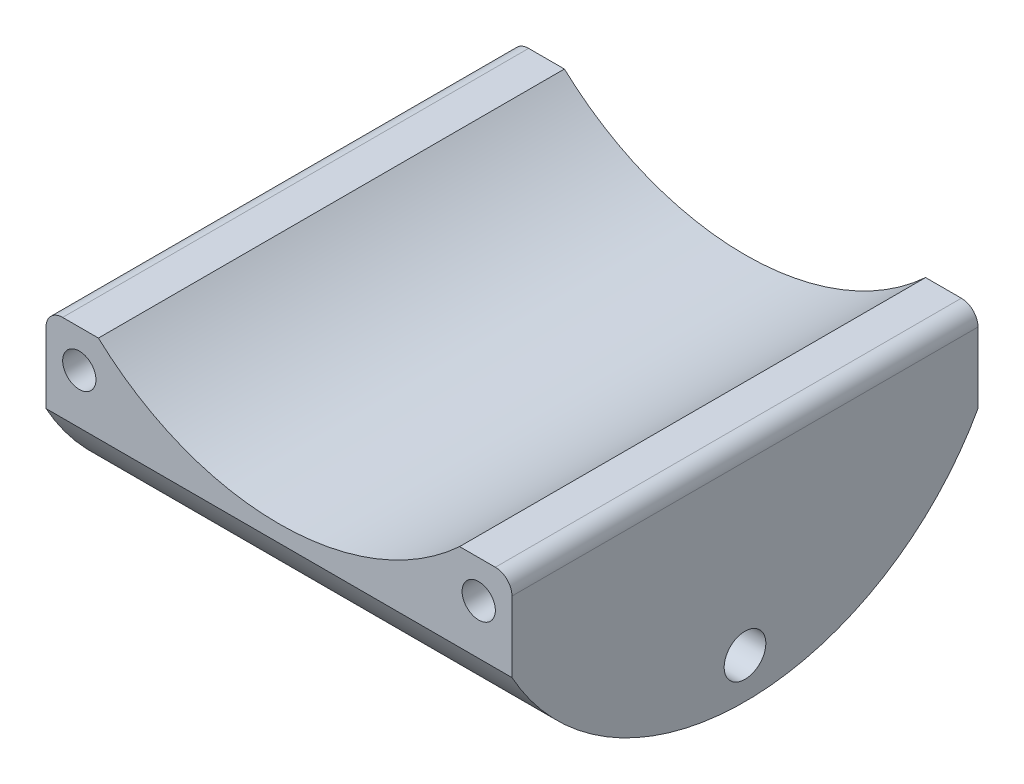
ISO-10303-21;
HEADER;
FILE_DESCRIPTION(('STEP AP214'),'2;1');
FILE_NAME('part.step','',(''),(''),'','','');
FILE_SCHEMA(('AUTOMOTIVE_DESIGN { 1 0 10303 214 1 1 1 1 }'));
ENDSEC;
DATA;
#1=APPLICATION_CONTEXT('core data for automotive mechanical design processes');
#2=APPLICATION_PROTOCOL_DEFINITION('international standard','automotive_design',2000,#1);
#3=PRODUCT_CONTEXT('',#1,'mechanical');
#4=PRODUCT('Part','Part','',(#3));
#5=PRODUCT_RELATED_PRODUCT_CATEGORY('part','',(#4));
#6=PRODUCT_DEFINITION_FORMATION('','',#4);
#7=PRODUCT_DEFINITION_CONTEXT('part definition',#1,'design');
#8=PRODUCT_DEFINITION('design','',#6,#7);
#9=PRODUCT_DEFINITION_SHAPE('','',#8);
#10=(LENGTH_UNIT() NAMED_UNIT(*) SI_UNIT(.MILLI.,.METRE.));
#11=(NAMED_UNIT(*) PLANE_ANGLE_UNIT() SI_UNIT($,.RADIAN.));
#12=(NAMED_UNIT(*) SI_UNIT($,.STERADIAN.) SOLID_ANGLE_UNIT());
#13=UNCERTAINTY_MEASURE_WITH_UNIT(LENGTH_MEASURE(1.E-05),#10,'distance_accuracy_value','');
#14=(GEOMETRIC_REPRESENTATION_CONTEXT(3) GLOBAL_UNCERTAINTY_ASSIGNED_CONTEXT((#13)) GLOBAL_UNIT_ASSIGNED_CONTEXT((#10,
#11,#12)) REPRESENTATION_CONTEXT('',''));
#15=CARTESIAN_POINT('',(0.,0.,0.));
#16=DIRECTION('',(0.,0.,1.));
#17=DIRECTION('',(1.,0.,0.));
#18=AXIS2_PLACEMENT_3D('',#15,#16,#17);
#19=CARTESIAN_POINT('',(-44.45,7.9502,0.));
#20=DIRECTION('',(1.,0.,0.));
#21=DIRECTION('',(0.,0.,-1.));
#22=AXIS2_PLACEMENT_3D('',#19,#20,#21);
#23=PLANE('',#22);
#24=DIRECTION('',(0.,-1.,0.));
#25=VECTOR('',#24,1.);
#26=CARTESIAN_POINT('',(-44.45,0.,44.45));
#27=LINE('',#26,#25);
#28=CARTESIAN_POINT('',(-44.45,-3.175,44.45));
#29=VERTEX_POINT('',#28);
#30=CARTESIAN_POINT('',(-44.45,-16.6432442484171,44.45));
#31=VERTEX_POINT('',#30);
#32=EDGE_CURVE('E150',#29,#31,#27,.T.);
#33=ORIENTED_EDGE('',*,*,#32,.F.);
#34=DIRECTION('',(0.,0.,-1.));
#35=VECTOR('',#34,1.);
#36=CARTESIAN_POINT('',(-44.45,-3.175,-44.45));
#37=LINE('',#36,#35);
#38=CARTESIAN_POINT('',(-44.45,-3.175,-44.45));
#39=VERTEX_POINT('',#38);
#40=EDGE_CURVE('E40',#29,#39,#37,.T.);
#41=ORIENTED_EDGE('',*,*,#40,.T.);
#42=DIRECTION('',(0.,-1.,0.));
#43=VECTOR('',#42,1.);
#44=CARTESIAN_POINT('',(-44.45,0.,-44.45));
#45=LINE('',#44,#43);
#46=CARTESIAN_POINT('',(-44.45,-16.6432442484171,-44.45));
#47=VERTEX_POINT('',#46);
#48=EDGE_CURVE('E123',#39,#47,#45,.T.);
#49=ORIENTED_EDGE('',*,*,#48,.T.);
#50=CARTESIAN_POINT('',(-44.45,7.9502,0.));
#51=DIRECTION('',(1.,0.,0.));
#52=DIRECTION('',(0.,0.,-1.));
#53=AXIS2_PLACEMENT_3D('',#50,#51,#52);
#54=CIRCLE('',#53,50.8);
#55=EDGE_CURVE('E159',#31,#47,#54,.T.);
#56=ORIENTED_EDGE('',*,*,#55,.F.);
#57=EDGE_LOOP('',(#33,#41,#49,#56));
#58=FACE_BOUND('',#57,.T.);
#59=CARTESIAN_POINT('',(-44.45,-35.179,0.));
#60=DIRECTION('',(1.,0.,0.));
#61=DIRECTION('',(0.,0.,-1.));
#62=AXIS2_PLACEMENT_3D('',#59,#60,#61);
#63=CIRCLE('',#62,3.9751);
#64=CARTESIAN_POINT('',(-44.45,-35.179,-3.9751));
#65=VERTEX_POINT('',#64);
#66=EDGE_CURVE('E198',#65,#65,#63,.T.);
#67=ORIENTED_EDGE('',*,*,#66,.T.);
#68=EDGE_LOOP('',(#67));
#69=FACE_BOUND('',#68,.T.);
#70=ADVANCED_FACE('F32',(#58,#69),#23,.F.);
#71=CARTESIAN_POINT('',(44.45,0.,-44.45));
#72=DIRECTION('',(0.,0.,-1.));
#73=DIRECTION('',(0.,1.,0.));
#74=AXIS2_PLACEMENT_3D('',#71,#72,#73);
#75=PLANE('',#74);
#76=CARTESIAN_POINT('',(-38.1,-7.13740000000001,-44.45));
#77=DIRECTION('',(0.,0.,1.));
#78=DIRECTION('',(1.,0.,0.));
#79=AXIS2_PLACEMENT_3D('',#76,#77,#78);
#80=CIRCLE('',#79,3.17500000000001);
#81=CARTESIAN_POINT('',(-34.925,-7.13740000000001,-44.45));
#82=VERTEX_POINT('',#81);
#83=EDGE_CURVE('E180',#82,#82,#80,.T.);
#84=ORIENTED_EDGE('',*,*,#83,.T.);
#85=EDGE_LOOP('',(#84));
#86=FACE_BOUND('',#85,.T.);
#87=DIRECTION('',(-1.,0.,0.));
#88=VECTOR('',#87,1.);
#89=CARTESIAN_POINT('',(44.45,0.,-44.45));
#90=LINE('',#89,#88);
#91=CARTESIAN_POINT('',(41.275,0.,-44.45));
#92=VERTEX_POINT('',#91);
#93=CARTESIAN_POINT('',(34.4525762825388,0.,-44.45));
#94=VERTEX_POINT('',#93);
#95=EDGE_CURVE('E125',#92,#94,#90,.T.);
#96=ORIENTED_EDGE('',*,*,#95,.F.);
#97=CARTESIAN_POINT('',(41.275,-3.175,-44.45));
#98=DIRECTION('',(0.,0.,-1.));
#99=DIRECTION('',(0.,1.,0.));
#100=AXIS2_PLACEMENT_3D('',#97,#98,#99);
#101=CIRCLE('',#100,3.175);
#102=CARTESIAN_POINT('',(44.45,-3.175,-44.45));
#103=VERTEX_POINT('',#102);
#104=EDGE_CURVE('E138',#92,#103,#101,.T.);
#105=ORIENTED_EDGE('',*,*,#104,.T.);
#106=DIRECTION('',(0.,-1.,0.));
#107=VECTOR('',#106,1.);
#108=CARTESIAN_POINT('',(44.45,0.,-44.45));
#109=LINE('',#108,#107);
#110=CARTESIAN_POINT('',(44.45,-16.6432442484171,-44.45));
#111=VERTEX_POINT('',#110);
#112=EDGE_CURVE('E116',#103,#111,#109,.T.);
#113=ORIENTED_EDGE('',*,*,#112,.T.);
#114=DIRECTION('',(-1.,0.,0.));
#115=VECTOR('',#114,1.);
#116=CARTESIAN_POINT('',(44.45,-16.6432442484171,-44.45));
#117=LINE('',#116,#115);
#118=EDGE_CURVE('E127',#111,#47,#117,.T.);
#119=ORIENTED_EDGE('',*,*,#118,.T.);
#120=ORIENTED_EDGE('',*,*,#48,.F.);
#121=CARTESIAN_POINT('',(-41.275,-3.175,-44.45));
#122=DIRECTION('',(0.,0.,-1.));
#123=DIRECTION('',(0.,1.,0.));
#124=AXIS2_PLACEMENT_3D('',#121,#122,#123);
#125=CIRCLE('',#124,3.175);
#126=CARTESIAN_POINT('',(-41.275,0.,-44.45));
#127=VERTEX_POINT('',#126);
#128=EDGE_CURVE('E136',#39,#127,#125,.T.);
#129=ORIENTED_EDGE('',*,*,#128,.T.);
#130=CARTESIAN_POINT('',(-34.4525762825388,0.,-44.45));
#131=VERTEX_POINT('',#130);
#132=EDGE_CURVE('E118',#131,#127,#90,.T.);
#133=ORIENTED_EDGE('',*,*,#132,.F.);
#134=CARTESIAN_POINT('',(0.,37.3317557515829,-44.45));
#135=DIRECTION('',(0.,0.,-1.));
#136=DIRECTION('',(0.,1.,0.));
#137=AXIS2_PLACEMENT_3D('',#134,#135,#136);
#138=CIRCLE('',#137,50.8);
#139=EDGE_CURVE('E104',#131,#94,#138,.F.);
#140=ORIENTED_EDGE('',*,*,#139,.T.);
#141=EDGE_LOOP('',(#96,#105,#113,#119,#120,#129,#133,#140));
#142=FACE_BOUND('',#141,.T.);
#143=CARTESIAN_POINT('',(38.1,-7.13740000000001,-44.45));
#144=DIRECTION('',(0.,0.,1.));
#145=DIRECTION('',(1.,0.,0.));
#146=AXIS2_PLACEMENT_3D('',#143,#144,#145);
#147=CIRCLE('',#146,3.17500000000001);
#148=CARTESIAN_POINT('',(41.275,-7.13740000000001,-44.45));
#149=VERTEX_POINT('',#148);
#150=EDGE_CURVE('E186',#149,#149,#147,.T.);
#151=ORIENTED_EDGE('',*,*,#150,.T.);
#152=EDGE_LOOP('',(#151));
#153=FACE_BOUND('',#152,.T.);
#154=ADVANCED_FACE('F154',(#86,#142,#153),#75,.T.);
#155=CARTESIAN_POINT('',(44.45,0.,44.45));
#156=DIRECTION('',(0.,0.,-1.));
#157=DIRECTION('',(0.,1.,0.));
#158=AXIS2_PLACEMENT_3D('',#155,#156,#157);
#159=PLANE('',#158);
#160=CARTESIAN_POINT('',(38.1,-7.13740000000001,44.45));
#161=DIRECTION('',(0.,0.,1.));
#162=DIRECTION('',(1.,0.,0.));
#163=AXIS2_PLACEMENT_3D('',#160,#161,#162);
#164=CIRCLE('',#163,3.17500000000001);
#165=CARTESIAN_POINT('',(41.275,-7.13740000000001,44.45));
#166=VERTEX_POINT('',#165);
#167=EDGE_CURVE('E176',#166,#166,#164,.T.);
#168=ORIENTED_EDGE('',*,*,#167,.F.);
#169=EDGE_LOOP('',(#168));
#170=FACE_BOUND('',#169,.T.);
#171=CARTESIAN_POINT('',(-38.1,-7.13740000000001,44.45));
#172=DIRECTION('',(0.,0.,1.));
#173=DIRECTION('',(1.,0.,0.));
#174=AXIS2_PLACEMENT_3D('',#171,#172,#173);
#175=CIRCLE('',#174,3.17500000000001);
#176=CARTESIAN_POINT('',(-34.925,-7.13740000000001,44.45));
#177=VERTEX_POINT('',#176);
#178=EDGE_CURVE('E168',#177,#177,#175,.T.);
#179=ORIENTED_EDGE('',*,*,#178,.F.);
#180=EDGE_LOOP('',(#179));
#181=FACE_BOUND('',#180,.T.);
#182=DIRECTION('',(0.,-1.,0.));
#183=VECTOR('',#182,1.);
#184=CARTESIAN_POINT('',(44.45,0.,44.45));
#185=LINE('',#184,#183);
#186=CARTESIAN_POINT('',(44.45,-3.175,44.45));
#187=VERTEX_POINT('',#186);
#188=CARTESIAN_POINT('',(44.45,-16.6432442484171,44.45));
#189=VERTEX_POINT('',#188);
#190=EDGE_CURVE('E158',#187,#189,#185,.T.);
#191=ORIENTED_EDGE('',*,*,#190,.F.);
#192=CARTESIAN_POINT('',(41.275,-3.175,44.45));
#193=DIRECTION('',(0.,0.,-1.));
#194=DIRECTION('',(0.,1.,0.));
#195=AXIS2_PLACEMENT_3D('',#192,#193,#194);
#196=CIRCLE('',#195,3.175);
#197=CARTESIAN_POINT('',(41.275,0.,44.45));
#198=VERTEX_POINT('',#197);
#199=EDGE_CURVE('E143',#187,#198,#196,.F.);
#200=ORIENTED_EDGE('',*,*,#199,.T.);
#201=DIRECTION('',(-1.,0.,0.));
#202=VECTOR('',#201,1.);
#203=CARTESIAN_POINT('',(44.45,0.,44.45));
#204=LINE('',#203,#202);
#205=CARTESIAN_POINT('',(34.4525762825388,0.,44.45));
#206=VERTEX_POINT('',#205);
#207=EDGE_CURVE('E112',#198,#206,#204,.T.);
#208=ORIENTED_EDGE('',*,*,#207,.T.);
#209=CARTESIAN_POINT('',(0.,37.3317557515829,44.45));
#210=DIRECTION('',(0.,0.,1.));
#211=DIRECTION('',(1.,0.,0.));
#212=AXIS2_PLACEMENT_3D('',#209,#210,#211);
#213=CIRCLE('',#212,50.8);
#214=CARTESIAN_POINT('',(-34.4525762825388,0.,44.45));
#215=VERTEX_POINT('',#214);
#216=EDGE_CURVE('E101',#215,#206,#213,.T.);
#217=ORIENTED_EDGE('',*,*,#216,.F.);
#218=CARTESIAN_POINT('',(-41.275,0.,44.45));
#219=VERTEX_POINT('',#218);
#220=EDGE_CURVE('E110',#215,#219,#204,.T.);
#221=ORIENTED_EDGE('',*,*,#220,.T.);
#222=CARTESIAN_POINT('',(-41.275,-3.175,44.45));
#223=DIRECTION('',(0.,0.,-1.));
#224=DIRECTION('',(0.,1.,0.));
#225=AXIS2_PLACEMENT_3D('',#222,#223,#224);
#226=CIRCLE('',#225,3.175);
#227=EDGE_CURVE('E47',#219,#29,#226,.F.);
#228=ORIENTED_EDGE('',*,*,#227,.T.);
#229=ORIENTED_EDGE('',*,*,#32,.T.);
#230=DIRECTION('',(-1.,0.,0.));
#231=VECTOR('',#230,1.);
#232=CARTESIAN_POINT('',(44.45,-16.6432442484171,44.45));
#233=LINE('',#232,#231);
#234=EDGE_CURVE('E130',#189,#31,#233,.T.);
#235=ORIENTED_EDGE('',*,*,#234,.F.);
#236=EDGE_LOOP('',(#191,#200,#208,#217,#221,#228,#229,#235));
#237=FACE_BOUND('',#236,.T.);
#238=ADVANCED_FACE('F109',(#170,#181,#237),#159,.F.);
#239=CARTESIAN_POINT('',(44.45,0.,44.45));
#240=DIRECTION('',(0.,1.,0.));
#241=DIRECTION('',(0.,0.,1.));
#242=AXIS2_PLACEMENT_3D('',#239,#240,#241);
#243=PLANE('',#242);
#244=ORIENTED_EDGE('',*,*,#207,.F.);
#245=DIRECTION('',(0.,0.,-1.));
#246=VECTOR('',#245,1.);
#247=CARTESIAN_POINT('',(41.275,0.,44.45));
#248=LINE('',#247,#246);
#249=EDGE_CURVE('E133',#198,#92,#248,.T.);
#250=ORIENTED_EDGE('',*,*,#249,.T.);
#251=ORIENTED_EDGE('',*,*,#95,.T.);
#252=DIRECTION('',(0.,0.,-1.));
#253=VECTOR('',#252,1.);
#254=CARTESIAN_POINT('',(34.4525762825388,0.,44.45));
#255=LINE('',#254,#253);
#256=EDGE_CURVE('E113',#206,#94,#255,.T.);
#257=ORIENTED_EDGE('',*,*,#256,.F.);
#258=EDGE_LOOP('',(#244,#250,#251,#257));
#259=FACE_BOUND('',#258,.T.);
#260=ADVANCED_FACE('F226',(#259),#243,.T.);
#261=ORIENTED_EDGE('',*,*,#132,.T.);
#262=DIRECTION('',(0.,0.,-1.));
#263=VECTOR('',#262,1.);
#264=CARTESIAN_POINT('',(-41.275,0.,44.45));
#265=LINE('',#264,#263);
#266=EDGE_CURVE('E11',#127,#219,#265,.F.);
#267=ORIENTED_EDGE('',*,*,#266,.T.);
#268=ORIENTED_EDGE('',*,*,#220,.F.);
#269=DIRECTION('',(0.,0.,-1.));
#270=VECTOR('',#269,1.);
#271=CARTESIAN_POINT('',(-34.4525762825388,0.,44.45));
#272=LINE('',#271,#270);
#273=EDGE_CURVE('E97',#215,#131,#272,.T.);
#274=ORIENTED_EDGE('',*,*,#273,.T.);
#275=EDGE_LOOP('',(#261,#267,#268,#274));
#276=FACE_BOUND('',#275,.T.);
#277=ADVANCED_FACE('F115',(#276),#243,.T.);
#278=CARTESIAN_POINT('',(44.45,7.9502,0.));
#279=DIRECTION('',(-1.,0.,0.));
#280=DIRECTION('',(0.,0.,1.));
#281=AXIS2_PLACEMENT_3D('',#278,#279,#280);
#282=CYLINDRICAL_SURFACE('',#281,50.8);
#283=ORIENTED_EDGE('',*,*,#55,.T.);
#284=ORIENTED_EDGE('',*,*,#118,.F.);
#285=CARTESIAN_POINT('',(44.45,7.9502,0.));
#286=DIRECTION('',(1.,0.,0.));
#287=DIRECTION('',(0.,0.,-1.));
#288=AXIS2_PLACEMENT_3D('',#285,#286,#287);
#289=CIRCLE('',#288,50.8);
#290=EDGE_CURVE('E119',#189,#111,#289,.T.);
#291=ORIENTED_EDGE('',*,*,#290,.F.);
#292=ORIENTED_EDGE('',*,*,#234,.T.);
#293=EDGE_LOOP('',(#283,#284,#291,#292));
#294=FACE_BOUND('',#293,.T.);
#295=ADVANCED_FACE('F230',(#294),#282,.T.);
#296=CARTESIAN_POINT('',(44.45,7.9502,0.));
#297=DIRECTION('',(1.,0.,0.));
#298=DIRECTION('',(0.,0.,-1.));
#299=AXIS2_PLACEMENT_3D('',#296,#297,#298);
#300=PLANE('',#299);
#301=CARTESIAN_POINT('',(44.45,-35.179,0.));
#302=DIRECTION('',(1.,0.,0.));
#303=DIRECTION('',(0.,0.,-1.));
#304=AXIS2_PLACEMENT_3D('',#301,#302,#303);
#305=CIRCLE('',#304,3.9751);
#306=CARTESIAN_POINT('',(44.45,-35.179,-3.9751));
#307=VERTEX_POINT('',#306);
#308=EDGE_CURVE('E192',#307,#307,#305,.T.);
#309=ORIENTED_EDGE('',*,*,#308,.F.);
#310=EDGE_LOOP('',(#309));
#311=FACE_BOUND('',#310,.T.);
#312=ORIENTED_EDGE('',*,*,#112,.F.);
#313=DIRECTION('',(0.,0.,-1.));
#314=VECTOR('',#313,1.);
#315=CARTESIAN_POINT('',(44.45,-3.175,0.));
#316=LINE('',#315,#314);
#317=EDGE_CURVE('E140',#103,#187,#316,.F.);
#318=ORIENTED_EDGE('',*,*,#317,.T.);
#319=ORIENTED_EDGE('',*,*,#190,.T.);
#320=ORIENTED_EDGE('',*,*,#290,.T.);
#321=EDGE_LOOP('',(#312,#318,#319,#320));
#322=FACE_BOUND('',#321,.T.);
#323=ADVANCED_FACE('F224',(#311,#322),#300,.T.);
#324=CARTESIAN_POINT('',(0.,37.3317557515829,44.45));
#325=DIRECTION('',(0.,0.,-1.));
#326=DIRECTION('',(-1.,0.,0.));
#327=AXIS2_PLACEMENT_3D('',#324,#325,#326);
#328=CYLINDRICAL_SURFACE('',#327,50.8);
#329=ORIENTED_EDGE('',*,*,#139,.F.);
#330=ORIENTED_EDGE('',*,*,#273,.F.);
#331=ORIENTED_EDGE('',*,*,#216,.T.);
#332=ORIENTED_EDGE('',*,*,#256,.T.);
#333=EDGE_LOOP('',(#329,#330,#331,#332));
#334=FACE_BOUND('',#333,.T.);
#335=ADVANCED_FACE('F99',(#334),#328,.F.);
#336=CARTESIAN_POINT('',(41.275,-3.175,44.45));
#337=DIRECTION('',(0.,0.,-1.));
#338=DIRECTION('',(-1.,0.,0.));
#339=AXIS2_PLACEMENT_3D('',#336,#337,#338);
#340=CYLINDRICAL_SURFACE('',#339,3.175);
#341=ORIENTED_EDGE('',*,*,#199,.F.);
#342=ORIENTED_EDGE('',*,*,#317,.F.);
#343=ORIENTED_EDGE('',*,*,#104,.F.);
#344=ORIENTED_EDGE('',*,*,#249,.F.);
#345=EDGE_LOOP('',(#341,#342,#343,#344));
#346=FACE_BOUND('',#345,.T.);
#347=ADVANCED_FACE('F235',(#346),#340,.T.);
#348=CARTESIAN_POINT('',(-41.275,-3.175,0.));
#349=DIRECTION('',(0.,0.,1.));
#350=DIRECTION('',(1.,0.,0.));
#351=AXIS2_PLACEMENT_3D('',#348,#349,#350);
#352=CYLINDRICAL_SURFACE('',#351,3.175);
#353=ORIENTED_EDGE('',*,*,#227,.F.);
#354=ORIENTED_EDGE('',*,*,#266,.F.);
#355=ORIENTED_EDGE('',*,*,#128,.F.);
#356=ORIENTED_EDGE('',*,*,#40,.F.);
#357=EDGE_LOOP('',(#353,#354,#355,#356));
#358=FACE_BOUND('',#357,.T.);
#359=ADVANCED_FACE('F34',(#358),#352,.T.);
#360=CARTESIAN_POINT('',(-38.1,-7.13740000000001,23.8125));
#361=DIRECTION('',(0.,0.,1.));
#362=DIRECTION('',(1.,0.,0.));
#363=AXIS2_PLACEMENT_3D('',#360,#361,#362);
#364=CYLINDRICAL_SURFACE('',#363,3.17500000000001);
#365=CARTESIAN_POINT('',(-38.1,-7.13740000000001,23.8125));
#366=DIRECTION('',(0.,0.,1.));
#367=DIRECTION('',(1.,0.,0.));
#368=AXIS2_PLACEMENT_3D('',#365,#366,#367);
#369=CIRCLE('',#368,3.17500000000001);
#370=CARTESIAN_POINT('',(-34.925,-7.13740000000001,23.8125));
#371=VERTEX_POINT('',#370);
#372=EDGE_CURVE('E106',#371,#371,#369,.T.);
#373=ORIENTED_EDGE('',*,*,#372,.F.);
#374=EDGE_LOOP('',(#373));
#375=FACE_BOUND('',#374,.T.);
#376=ORIENTED_EDGE('',*,*,#178,.T.);
#377=EDGE_LOOP('',(#376));
#378=FACE_BOUND('',#377,.T.);
#379=ADVANCED_FACE('F242',(#375,#378),#364,.F.);
#380=CARTESIAN_POINT('',(-38.1,-7.13740000000001,23.8125));
#381=DIRECTION('',(0.,0.,1.));
#382=DIRECTION('',(1.,0.,0.));
#383=AXIS2_PLACEMENT_3D('',#380,#381,#382);
#384=PLANE('',#383);
#385=ORIENTED_EDGE('',*,*,#372,.T.);
#386=EDGE_LOOP('',(#385));
#387=FACE_BOUND('',#386,.T.);
#388=ADVANCED_FACE('F290',(#387),#384,.T.);
#389=CARTESIAN_POINT('',(38.1,-7.13740000000001,23.8125));
#390=DIRECTION('',(0.,0.,1.));
#391=DIRECTION('',(1.,0.,0.));
#392=AXIS2_PLACEMENT_3D('',#389,#390,#391);
#393=CYLINDRICAL_SURFACE('',#392,3.17500000000001);
#394=CARTESIAN_POINT('',(38.1,-7.13740000000001,23.8125));
#395=DIRECTION('',(0.,0.,1.));
#396=DIRECTION('',(1.,0.,0.));
#397=AXIS2_PLACEMENT_3D('',#394,#395,#396);
#398=CIRCLE('',#397,3.17500000000001);
#399=CARTESIAN_POINT('',(41.275,-7.13740000000001,23.8125));
#400=VERTEX_POINT('',#399);
#401=EDGE_CURVE('E171',#400,#400,#398,.T.);
#402=ORIENTED_EDGE('',*,*,#401,.F.);
#403=EDGE_LOOP('',(#402));
#404=FACE_BOUND('',#403,.T.);
#405=ORIENTED_EDGE('',*,*,#167,.T.);
#406=EDGE_LOOP('',(#405));
#407=FACE_BOUND('',#406,.T.);
#408=ADVANCED_FACE('F286',(#404,#407),#393,.F.);
#409=CARTESIAN_POINT('',(38.1,-7.13740000000001,23.8125));
#410=DIRECTION('',(0.,0.,1.));
#411=DIRECTION('',(1.,0.,0.));
#412=AXIS2_PLACEMENT_3D('',#409,#410,#411);
#413=PLANE('',#412);
#414=ORIENTED_EDGE('',*,*,#401,.T.);
#415=EDGE_LOOP('',(#414));
#416=FACE_BOUND('',#415,.T.);
#417=ADVANCED_FACE('F282',(#416),#413,.T.);
#418=CARTESIAN_POINT('',(-38.1,-7.13740000000001,-23.8125));
#419=DIRECTION('',(0.,0.,-1.));
#420=DIRECTION('',(-1.,0.,0.));
#421=AXIS2_PLACEMENT_3D('',#418,#419,#420);
#422=CYLINDRICAL_SURFACE('',#421,3.17500000000001);
#423=CARTESIAN_POINT('',(-38.1,-7.13740000000001,-23.8125));
#424=DIRECTION('',(0.,0.,1.));
#425=DIRECTION('',(1.,0.,0.));
#426=AXIS2_PLACEMENT_3D('',#423,#424,#425);
#427=CIRCLE('',#426,3.17500000000001);
#428=CARTESIAN_POINT('',(-34.925,-7.13740000000001,-23.8125));
#429=VERTEX_POINT('',#428);
#430=EDGE_CURVE('E179',#429,#429,#427,.T.);
#431=ORIENTED_EDGE('',*,*,#430,.T.);
#432=EDGE_LOOP('',(#431));
#433=FACE_BOUND('',#432,.T.);
#434=ORIENTED_EDGE('',*,*,#83,.F.);
#435=EDGE_LOOP('',(#434));
#436=FACE_BOUND('',#435,.T.);
#437=ADVANCED_FACE('F278',(#433,#436),#422,.F.);
#438=CARTESIAN_POINT('',(-38.1,-7.13740000000001,-23.8125));
#439=DIRECTION('',(0.,0.,-1.));
#440=DIRECTION('',(1.,0.,0.));
#441=AXIS2_PLACEMENT_3D('',#438,#439,#440);
#442=PLANE('',#441);
#443=ORIENTED_EDGE('',*,*,#430,.F.);
#444=EDGE_LOOP('',(#443));
#445=FACE_BOUND('',#444,.T.);
#446=ADVANCED_FACE('F274',(#445),#442,.T.);
#447=CARTESIAN_POINT('',(38.1,-7.13740000000001,-23.8125));
#448=DIRECTION('',(0.,0.,-1.));
#449=DIRECTION('',(-1.,0.,0.));
#450=AXIS2_PLACEMENT_3D('',#447,#448,#449);
#451=CYLINDRICAL_SURFACE('',#450,3.17500000000001);
#452=CARTESIAN_POINT('',(38.1,-7.13740000000001,-23.8125));
#453=DIRECTION('',(0.,0.,1.));
#454=DIRECTION('',(1.,0.,0.));
#455=AXIS2_PLACEMENT_3D('',#452,#453,#454);
#456=CIRCLE('',#455,3.17500000000001);
#457=CARTESIAN_POINT('',(41.275,-7.13740000000001,-23.8125));
#458=VERTEX_POINT('',#457);
#459=EDGE_CURVE('E183',#458,#458,#456,.T.);
#460=ORIENTED_EDGE('',*,*,#459,.T.);
#461=EDGE_LOOP('',(#460));
#462=FACE_BOUND('',#461,.T.);
#463=ORIENTED_EDGE('',*,*,#150,.F.);
#464=EDGE_LOOP('',(#463));
#465=FACE_BOUND('',#464,.T.);
#466=ADVANCED_FACE('F267',(#462,#465),#451,.F.);
#467=CARTESIAN_POINT('',(38.1,-7.13740000000001,-23.8125));
#468=DIRECTION('',(0.,0.,-1.));
#469=DIRECTION('',(1.,0.,0.));
#470=AXIS2_PLACEMENT_3D('',#467,#468,#469);
#471=PLANE('',#470);
#472=ORIENTED_EDGE('',*,*,#459,.F.);
#473=EDGE_LOOP('',(#472));
#474=FACE_BOUND('',#473,.T.);
#475=ADVANCED_FACE('F258',(#474),#471,.T.);
#476=CARTESIAN_POINT('',(26.9875,-35.179,0.));
#477=DIRECTION('',(1.,0.,0.));
#478=DIRECTION('',(0.,0.,-1.));
#479=AXIS2_PLACEMENT_3D('',#476,#477,#478);
#480=CYLINDRICAL_SURFACE('',#479,3.9751);
#481=CARTESIAN_POINT('',(26.9875,-35.179,0.));
#482=DIRECTION('',(1.,0.,0.));
#483=DIRECTION('',(0.,0.,-1.));
#484=AXIS2_PLACEMENT_3D('',#481,#482,#483);
#485=CIRCLE('',#484,3.9751);
#486=CARTESIAN_POINT('',(26.9875,-35.179,-3.9751));
#487=VERTEX_POINT('',#486);
#488=EDGE_CURVE('E189',#487,#487,#485,.T.);
#489=ORIENTED_EDGE('',*,*,#488,.F.);
#490=EDGE_LOOP('',(#489));
#491=FACE_BOUND('',#490,.T.);
#492=ORIENTED_EDGE('',*,*,#308,.T.);
#493=EDGE_LOOP('',(#492));
#494=FACE_BOUND('',#493,.T.);
#495=ADVANCED_FACE('F256',(#491,#494),#480,.F.);
#496=CARTESIAN_POINT('',(26.9875,-35.179,0.));
#497=DIRECTION('',(1.,0.,0.));
#498=DIRECTION('',(0.,0.,-1.));
#499=AXIS2_PLACEMENT_3D('',#496,#497,#498);
#500=PLANE('',#499);
#501=ORIENTED_EDGE('',*,*,#488,.T.);
#502=EDGE_LOOP('',(#501));
#503=FACE_BOUND('',#502,.T.);
#504=ADVANCED_FACE('F213',(#503),#500,.T.);
#505=CARTESIAN_POINT('',(-26.9875,-35.179,0.));
#506=DIRECTION('',(-1.,0.,0.));
#507=DIRECTION('',(0.,0.,1.));
#508=AXIS2_PLACEMENT_3D('',#505,#506,#507);
#509=CYLINDRICAL_SURFACE('',#508,3.9751);
#510=CARTESIAN_POINT('',(-26.9875,-35.179,0.));
#511=DIRECTION('',(1.,0.,0.));
#512=DIRECTION('',(0.,0.,-1.));
#513=AXIS2_PLACEMENT_3D('',#510,#511,#512);
#514=CIRCLE('',#513,3.9751);
#515=CARTESIAN_POINT('',(-26.9875,-35.179,-3.9751));
#516=VERTEX_POINT('',#515);
#517=EDGE_CURVE('E195',#516,#516,#514,.T.);
#518=ORIENTED_EDGE('',*,*,#517,.T.);
#519=EDGE_LOOP('',(#518));
#520=FACE_BOUND('',#519,.T.);
#521=ORIENTED_EDGE('',*,*,#66,.F.);
#522=EDGE_LOOP('',(#521));
#523=FACE_BOUND('',#522,.T.);
#524=ADVANCED_FACE('F204',(#520,#523),#509,.F.);
#525=CARTESIAN_POINT('',(-26.9875,-35.179,0.));
#526=DIRECTION('',(-1.,0.,0.));
#527=DIRECTION('',(0.,0.,-1.));
#528=AXIS2_PLACEMENT_3D('',#525,#526,#527);
#529=PLANE('',#528);
#530=ORIENTED_EDGE('',*,*,#517,.F.);
#531=EDGE_LOOP('',(#530));
#532=FACE_BOUND('',#531,.T.);
#533=ADVANCED_FACE('F207',(#532),#529,.T.);
#534=CLOSED_SHELL('',(#70,#154,#238,#260,#277,#295,#323,#335,#347,#359,#379,#388,#408,#417,#437,
#446,#466,#475,#495,#504,#524,#533));
#535=MANIFOLD_SOLID_BREP('B2',#534);
#536=ADVANCED_BREP_SHAPE_REPRESENTATION('',(#18,#535),#14);
#537=SHAPE_DEFINITION_REPRESENTATION(#9,#536);
ENDSEC;
END-ISO-10303-21;
